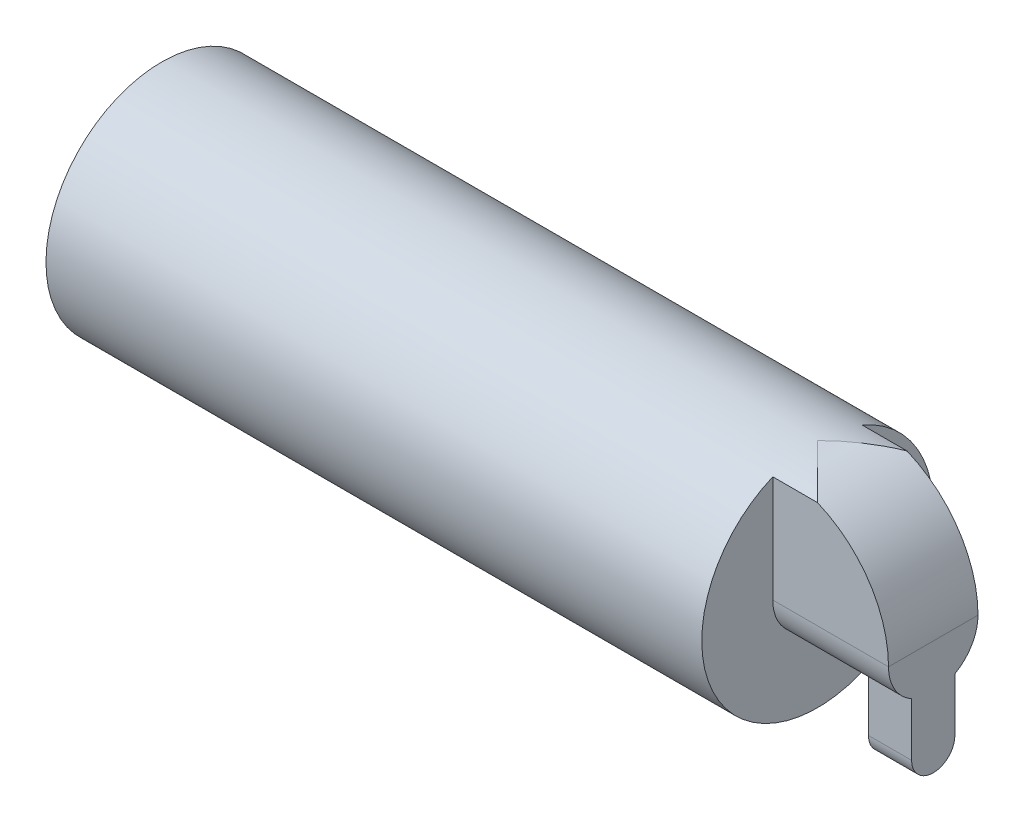
ISO-10303-21;
HEADER;
FILE_DESCRIPTION(('STEP AP214'),'2;1');
FILE_NAME('part.step','',(''),(''),'','','');
FILE_SCHEMA(('AUTOMOTIVE_DESIGN { 1 0 10303 214 1 1 1 1 }'));
ENDSEC;
DATA;
#1=APPLICATION_CONTEXT('core data for automotive mechanical design processes');
#2=APPLICATION_PROTOCOL_DEFINITION('international standard','automotive_design',2000,#1);
#3=PRODUCT_CONTEXT('',#1,'mechanical');
#4=PRODUCT('Part','Part','',(#3));
#5=PRODUCT_RELATED_PRODUCT_CATEGORY('part','',(#4));
#6=PRODUCT_DEFINITION_FORMATION('','',#4);
#7=PRODUCT_DEFINITION_CONTEXT('part definition',#1,'design');
#8=PRODUCT_DEFINITION('design','',#6,#7);
#9=PRODUCT_DEFINITION_SHAPE('','',#8);
#10=(LENGTH_UNIT() NAMED_UNIT(*) SI_UNIT(.MILLI.,.METRE.));
#11=(NAMED_UNIT(*) PLANE_ANGLE_UNIT() SI_UNIT($,.RADIAN.));
#12=(NAMED_UNIT(*) SI_UNIT($,.STERADIAN.) SOLID_ANGLE_UNIT());
#13=UNCERTAINTY_MEASURE_WITH_UNIT(LENGTH_MEASURE(1.E-05),#10,'distance_accuracy_value','');
#14=(GEOMETRIC_REPRESENTATION_CONTEXT(3) GLOBAL_UNCERTAINTY_ASSIGNED_CONTEXT((#13)) GLOBAL_UNIT_ASSIGNED_CONTEXT((#10,
#11,#12)) REPRESENTATION_CONTEXT('',''));
#15=CARTESIAN_POINT('',(0.,0.,0.));
#16=DIRECTION('',(0.,0.,1.));
#17=DIRECTION('',(1.,0.,0.));
#18=AXIS2_PLACEMENT_3D('',#15,#16,#17);
#19=CARTESIAN_POINT('',(42.5,0.,0.));
#20=DIRECTION('',(-1.,0.,0.));
#21=DIRECTION('',(0.,0.,1.));
#22=AXIS2_PLACEMENT_3D('',#19,#20,#21);
#23=CYLINDRICAL_SURFACE('',#22,7.5);
#24=CARTESIAN_POINT('',(0.,0.,0.));
#25=DIRECTION('',(1.,0.,0.));
#26=DIRECTION('',(0.,0.,-1.));
#27=AXIS2_PLACEMENT_3D('',#24,#25,#26);
#28=CIRCLE('',#27,7.5);
#29=CARTESIAN_POINT('',(0.,0.,-7.5));
#30=VERTEX_POINT('',#29);
#31=EDGE_CURVE('E386',#30,#30,#28,.T.);
#32=ORIENTED_EDGE('',*,*,#31,.T.);
#33=EDGE_LOOP('',(#32));
#34=FACE_BOUND('',#33,.T.);
#35=CARTESIAN_POINT('',(42.5,0.,0.));
#36=DIRECTION('',(-0.707106781186547,0.,-0.707106781186547));
#37=DIRECTION('',(-0.707106781186547,0.,0.707106781186547));
#38=AXIS2_PLACEMENT_3D('',#35,#36,#37);
#39=ELLIPSE('',#38,10.6066017177982,7.5);
#40=CARTESIAN_POINT('',(45.4,6.91664658631623,-2.9));
#41=VERTEX_POINT('',#40);
#42=CARTESIAN_POINT('',(42.5,7.5,0.));
#43=VERTEX_POINT('',#42);
#44=EDGE_CURVE('E335',#41,#43,#39,.F.);
#45=ORIENTED_EDGE('',*,*,#44,.F.);
#46=DIRECTION('',(-1.,0.,0.));
#47=VECTOR('',#46,1.);
#48=CARTESIAN_POINT('',(50.,6.91664658631623,-2.9));
#49=LINE('',#48,#47);
#50=CARTESIAN_POINT('',(42.5,6.91664658631623,-2.9));
#51=VERTEX_POINT('',#50);
#52=EDGE_CURVE('E372',#41,#51,#49,.T.);
#53=ORIENTED_EDGE('',*,*,#52,.T.);
#54=CARTESIAN_POINT('',(42.5,0.,0.));
#55=DIRECTION('',(1.,0.,0.));
#56=DIRECTION('',(0.,0.,-1.));
#57=AXIS2_PLACEMENT_3D('',#54,#55,#56);
#58=CIRCLE('',#57,7.5);
#59=CARTESIAN_POINT('',(42.5,6.91664658631623,2.9));
#60=VERTEX_POINT('',#59);
#61=EDGE_CURVE('E387',#60,#51,#58,.T.);
#62=ORIENTED_EDGE('',*,*,#61,.F.);
#63=DIRECTION('',(-1.,0.,0.));
#64=VECTOR('',#63,1.);
#65=CARTESIAN_POINT('',(50.,6.91664658631623,2.9));
#66=LINE('',#65,#64);
#67=CARTESIAN_POINT('',(45.4,6.91664658631623,2.9));
#68=VERTEX_POINT('',#67);
#69=EDGE_CURVE('E370',#68,#60,#66,.T.);
#70=ORIENTED_EDGE('',*,*,#69,.F.);
#71=CARTESIAN_POINT('',(42.5,0.,0.));
#72=DIRECTION('',(-0.707106781186547,0.,0.707106781186547));
#73=DIRECTION('',(-0.707106781186547,0.,-0.707106781186547));
#74=AXIS2_PLACEMENT_3D('',#71,#72,#73);
#75=ELLIPSE('',#74,10.6066017177982,7.5);
#76=EDGE_CURVE('E333',#43,#68,#75,.F.);
#77=ORIENTED_EDGE('',*,*,#76,.F.);
#78=EDGE_LOOP('',(#45,#53,#62,#70,#77));
#79=FACE_BOUND('',#78,.T.);
#80=ADVANCED_FACE('F33',(#34,#79),#23,.T.);
#81=CARTESIAN_POINT('',(50.,0.,-2.9));
#82=DIRECTION('',(0.,0.,1.));
#83=DIRECTION('',(1.,0.,0.));
#84=AXIS2_PLACEMENT_3D('',#81,#82,#83);
#85=PLANE('',#84);
#86=CARTESIAN_POINT('',(42.5,0.,-2.9));
#87=DIRECTION('',(0.,0.,1.));
#88=DIRECTION('',(1.,0.,0.));
#89=AXIS2_PLACEMENT_3D('',#86,#87,#88);
#90=CIRCLE('',#89,7.50000000000001);
#91=CARTESIAN_POINT('',(50.,0.,-2.9));
#92=VERTEX_POINT('',#91);
#93=EDGE_CURVE('E337',#92,#41,#90,.T.);
#94=ORIENTED_EDGE('',*,*,#93,.F.);
#95=DIRECTION('',(-1.,0.,0.));
#96=VECTOR('',#95,1.);
#97=CARTESIAN_POINT('',(50.,0.,-2.9));
#98=LINE('',#97,#96);
#99=CARTESIAN_POINT('',(42.5,0.,-2.9));
#100=VERTEX_POINT('',#99);
#101=EDGE_CURVE('E374',#92,#100,#98,.T.);
#102=ORIENTED_EDGE('',*,*,#101,.T.);
#103=DIRECTION('',(0.,-1.,0.));
#104=VECTOR('',#103,1.);
#105=CARTESIAN_POINT('',(42.5,0.,-2.9));
#106=LINE('',#105,#104);
#107=EDGE_CURVE('E380',#51,#100,#106,.T.);
#108=ORIENTED_EDGE('',*,*,#107,.F.);
#109=ORIENTED_EDGE('',*,*,#52,.F.);
#110=EDGE_LOOP('',(#94,#102,#108,#109));
#111=FACE_BOUND('',#110,.T.);
#112=ADVANCED_FACE('F430',(#111),#85,.F.);
#113=CARTESIAN_POINT('',(50.,0.,2.9));
#114=DIRECTION('',(0.,0.,-1.));
#115=DIRECTION('',(-1.,0.,0.));
#116=AXIS2_PLACEMENT_3D('',#113,#114,#115);
#117=PLANE('',#116);
#118=CARTESIAN_POINT('',(42.5,0.,2.9));
#119=DIRECTION('',(0.,0.,-1.));
#120=DIRECTION('',(-1.,0.,0.));
#121=AXIS2_PLACEMENT_3D('',#118,#119,#120);
#122=CIRCLE('',#121,7.50000000000001);
#123=CARTESIAN_POINT('',(50.,0.,2.9));
#124=VERTEX_POINT('',#123);
#125=EDGE_CURVE('E304',#68,#124,#122,.T.);
#126=ORIENTED_EDGE('',*,*,#125,.F.);
#127=ORIENTED_EDGE('',*,*,#69,.T.);
#128=DIRECTION('',(0.,1.,0.));
#129=VECTOR('',#128,1.);
#130=CARTESIAN_POINT('',(42.5,0.,2.9));
#131=LINE('',#130,#129);
#132=CARTESIAN_POINT('',(42.5,0.,2.9));
#133=VERTEX_POINT('',#132);
#134=EDGE_CURVE('E377',#133,#60,#131,.T.);
#135=ORIENTED_EDGE('',*,*,#134,.F.);
#136=DIRECTION('',(-1.,0.,0.));
#137=VECTOR('',#136,1.);
#138=CARTESIAN_POINT('',(50.,0.,2.9));
#139=LINE('',#138,#137);
#140=EDGE_CURVE('E367',#124,#133,#139,.T.);
#141=ORIENTED_EDGE('',*,*,#140,.F.);
#142=EDGE_LOOP('',(#126,#127,#135,#141));
#143=FACE_BOUND('',#142,.T.);
#144=ADVANCED_FACE('F411',(#143),#117,.F.);
#145=CARTESIAN_POINT('',(42.5,0.,0.));
#146=DIRECTION('',(1.,0.,0.));
#147=DIRECTION('',(0.,0.,-1.));
#148=AXIS2_PLACEMENT_3D('',#145,#146,#147);
#149=PLANE('',#148);
#150=ORIENTED_EDGE('',*,*,#61,.T.);
#151=ORIENTED_EDGE('',*,*,#107,.T.);
#152=CARTESIAN_POINT('',(42.5,0.,0.));
#153=DIRECTION('',(1.,0.,0.));
#154=DIRECTION('',(0.,0.,-1.));
#155=AXIS2_PLACEMENT_3D('',#152,#153,#154);
#156=CIRCLE('',#155,2.9);
#157=EDGE_CURVE('E383',#100,#133,#156,.F.);
#158=ORIENTED_EDGE('',*,*,#157,.T.);
#159=ORIENTED_EDGE('',*,*,#134,.T.);
#160=EDGE_LOOP('',(#150,#151,#158,#159));
#161=FACE_BOUND('',#160,.T.);
#162=ADVANCED_FACE('F445',(#161),#149,.T.);
#163=CARTESIAN_POINT('',(0.,0.,0.));
#164=DIRECTION('',(1.,0.,0.));
#165=DIRECTION('',(0.,0.,-1.));
#166=AXIS2_PLACEMENT_3D('',#163,#164,#165);
#167=PLANE('',#166);
#168=DIRECTION('',(0.,-1.,0.));
#169=VECTOR('',#168,1.);
#170=CARTESIAN_POINT('',(0.,-1.17157287525381,-2.82842712474619));
#171=LINE('',#170,#169);
#172=CARTESIAN_POINT('',(0.,-1.17157287525381,-2.82842712474619));
#173=VERTEX_POINT('',#172);
#174=CARTESIAN_POINT('',(0.,-2.82842712474619,-2.82842712474619));
#175=VERTEX_POINT('',#174);
#176=EDGE_CURVE('E262',#173,#175,#171,.T.);
#177=ORIENTED_EDGE('',*,*,#176,.F.);
#178=DIRECTION('',(0.,-0.707106781186548,0.707106781186547));
#179=VECTOR('',#178,1.);
#180=CARTESIAN_POINT('',(0.,0.,-4.));
#181=LINE('',#180,#179);
#182=CARTESIAN_POINT('',(0.,0.,-4.));
#183=VERTEX_POINT('',#182);
#184=EDGE_CURVE('E47',#183,#173,#181,.T.);
#185=ORIENTED_EDGE('',*,*,#184,.F.);
#186=DIRECTION('',(0.,-0.707106781186547,-0.707106781186548));
#187=VECTOR('',#186,1.);
#188=CARTESIAN_POINT('',(0.,0.,-4.));
#189=LINE('',#188,#187);
#190=CARTESIAN_POINT('',(0.,1.17157287525381,-2.82842712474619));
#191=VERTEX_POINT('',#190);
#192=EDGE_CURVE('E218',#191,#183,#189,.T.);
#193=ORIENTED_EDGE('',*,*,#192,.F.);
#194=DIRECTION('',(0.,-1.,0.));
#195=VECTOR('',#194,1.);
#196=CARTESIAN_POINT('',(0.,2.82842712474619,-2.82842712474619));
#197=LINE('',#196,#195);
#198=CARTESIAN_POINT('',(0.,2.82842712474619,-2.82842712474619));
#199=VERTEX_POINT('',#198);
#200=EDGE_CURVE('E221',#199,#191,#197,.T.);
#201=ORIENTED_EDGE('',*,*,#200,.F.);
#202=DIRECTION('',(0.,0.,-1.));
#203=VECTOR('',#202,1.);
#204=CARTESIAN_POINT('',(0.,2.82842712474619,-2.82842712474619));
#205=LINE('',#204,#203);
#206=CARTESIAN_POINT('',(0.,2.82842712474619,-1.17157287525381));
#207=VERTEX_POINT('',#206);
#208=EDGE_CURVE('E297',#207,#199,#205,.T.);
#209=ORIENTED_EDGE('',*,*,#208,.F.);
#210=DIRECTION('',(0.,-0.707106781186548,-0.707106781186547));
#211=VECTOR('',#210,1.);
#212=CARTESIAN_POINT('',(0.,2.82842712474619,-1.17157287525381));
#213=LINE('',#212,#211);
#214=CARTESIAN_POINT('',(0.,4.,0.));
#215=VERTEX_POINT('',#214);
#216=EDGE_CURVE('E294',#215,#207,#213,.T.);
#217=ORIENTED_EDGE('',*,*,#216,.F.);
#218=DIRECTION('',(0.,0.707106781186548,-0.707106781186547));
#219=VECTOR('',#218,1.);
#220=CARTESIAN_POINT('',(0.,4.,0.));
#221=LINE('',#220,#219);
#222=CARTESIAN_POINT('',(0.,2.82842712474619,1.17157287525381));
#223=VERTEX_POINT('',#222);
#224=EDGE_CURVE('E291',#223,#215,#221,.T.);
#225=ORIENTED_EDGE('',*,*,#224,.F.);
#226=DIRECTION('',(0.,0.,-1.));
#227=VECTOR('',#226,1.);
#228=CARTESIAN_POINT('',(0.,2.82842712474619,1.17157287525381));
#229=LINE('',#228,#227);
#230=CARTESIAN_POINT('',(0.,2.82842712474619,2.82842712474619));
#231=VERTEX_POINT('',#230);
#232=EDGE_CURVE('E288',#231,#223,#229,.T.);
#233=ORIENTED_EDGE('',*,*,#232,.F.);
#234=DIRECTION('',(0.,1.,0.));
#235=VECTOR('',#234,1.);
#236=CARTESIAN_POINT('',(0.,2.82842712474619,2.82842712474619));
#237=LINE('',#236,#235);
#238=CARTESIAN_POINT('',(0.,1.17157287525381,2.82842712474619));
#239=VERTEX_POINT('',#238);
#240=EDGE_CURVE('E285',#239,#231,#237,.T.);
#241=ORIENTED_EDGE('',*,*,#240,.F.);
#242=DIRECTION('',(0.,0.707106781186547,-0.707106781186548));
#243=VECTOR('',#242,1.);
#244=CARTESIAN_POINT('',(0.,1.17157287525381,2.82842712474619));
#245=LINE('',#244,#243);
#246=CARTESIAN_POINT('',(0.,0.,4.));
#247=VERTEX_POINT('',#246);
#248=EDGE_CURVE('E282',#247,#239,#245,.T.);
#249=ORIENTED_EDGE('',*,*,#248,.F.);
#250=DIRECTION('',(0.,0.707106781186548,0.707106781186547));
#251=VECTOR('',#250,1.);
#252=CARTESIAN_POINT('',(0.,-1.17157287525381,2.82842712474619));
#253=LINE('',#252,#251);
#254=CARTESIAN_POINT('',(0.,-1.17157287525381,2.82842712474619));
#255=VERTEX_POINT('',#254);
#256=EDGE_CURVE('E279',#255,#247,#253,.T.);
#257=ORIENTED_EDGE('',*,*,#256,.F.);
#258=DIRECTION('',(0.,1.,0.));
#259=VECTOR('',#258,1.);
#260=CARTESIAN_POINT('',(0.,-1.17157287525381,2.82842712474619));
#261=LINE('',#260,#259);
#262=CARTESIAN_POINT('',(0.,-2.82842712474619,2.82842712474619));
#263=VERTEX_POINT('',#262);
#264=EDGE_CURVE('E276',#263,#255,#261,.T.);
#265=ORIENTED_EDGE('',*,*,#264,.F.);
#266=DIRECTION('',(0.,0.,1.));
#267=VECTOR('',#266,1.);
#268=CARTESIAN_POINT('',(0.,-2.82842712474619,1.17157287525381));
#269=LINE('',#268,#267);
#270=CARTESIAN_POINT('',(0.,-2.82842712474619,1.17157287525381));
#271=VERTEX_POINT('',#270);
#272=EDGE_CURVE('E273',#271,#263,#269,.T.);
#273=ORIENTED_EDGE('',*,*,#272,.F.);
#274=DIRECTION('',(0.,0.707106781186547,0.707106781186547));
#275=VECTOR('',#274,1.);
#276=CARTESIAN_POINT('',(0.,-4.,0.));
#277=LINE('',#276,#275);
#278=CARTESIAN_POINT('',(0.,-4.,0.));
#279=VERTEX_POINT('',#278);
#280=EDGE_CURVE('E270',#279,#271,#277,.T.);
#281=ORIENTED_EDGE('',*,*,#280,.F.);
#282=DIRECTION('',(0.,-0.707106781186547,0.707106781186548));
#283=VECTOR('',#282,1.);
#284=CARTESIAN_POINT('',(0.,-2.82842712474619,-1.17157287525381));
#285=LINE('',#284,#283);
#286=CARTESIAN_POINT('',(0.,-2.82842712474619,-1.17157287525381));
#287=VERTEX_POINT('',#286);
#288=EDGE_CURVE('E267',#287,#279,#285,.T.);
#289=ORIENTED_EDGE('',*,*,#288,.F.);
#290=DIRECTION('',(0.,0.,1.));
#291=VECTOR('',#290,1.);
#292=CARTESIAN_POINT('',(0.,-2.82842712474619,-2.82842712474619));
#293=LINE('',#292,#291);
#294=EDGE_CURVE('E264',#175,#287,#293,.T.);
#295=ORIENTED_EDGE('',*,*,#294,.F.);
#296=EDGE_LOOP('',(#177,#185,#193,#201,#209,#217,#225,#233,#241,#249,#257,#265,#273,#281,#289,#295));
#297=FACE_BOUND('',#296,.T.);
#298=ORIENTED_EDGE('',*,*,#31,.F.);
#299=EDGE_LOOP('',(#298));
#300=FACE_BOUND('',#299,.T.);
#301=ADVANCED_FACE('F447',(#297,#300),#167,.F.);
#302=CARTESIAN_POINT('',(50.,0.,0.));
#303=DIRECTION('',(-1.,0.,0.));
#304=DIRECTION('',(0.,0.,1.));
#305=AXIS2_PLACEMENT_3D('',#302,#303,#304);
#306=CYLINDRICAL_SURFACE('',#305,2.9);
#307=CARTESIAN_POINT('',(47.2,0.,0.));
#308=DIRECTION('',(1.,0.,0.));
#309=DIRECTION('',(0.,0.,-1.));
#310=AXIS2_PLACEMENT_3D('',#307,#308,#309);
#311=CIRCLE('',#310,2.9);
#312=CARTESIAN_POINT('',(47.2,-2.53968501984006,1.4));
#313=VERTEX_POINT('',#312);
#314=CARTESIAN_POINT('',(47.2,-2.53968501984006,-1.4));
#315=VERTEX_POINT('',#314);
#316=EDGE_CURVE('E40',#313,#315,#311,.T.);
#317=ORIENTED_EDGE('',*,*,#316,.F.);
#318=DIRECTION('',(-1.,0.,0.));
#319=VECTOR('',#318,1.);
#320=CARTESIAN_POINT('',(50.,-2.53968501984006,1.4));
#321=LINE('',#320,#319);
#322=CARTESIAN_POINT('',(50.,-2.53968501984006,1.4));
#323=VERTEX_POINT('',#322);
#324=EDGE_CURVE('E360',#313,#323,#321,.F.);
#325=ORIENTED_EDGE('',*,*,#324,.T.);
#326=CARTESIAN_POINT('',(50.,0.,0.));
#327=DIRECTION('',(1.,0.,0.));
#328=DIRECTION('',(0.,0.,-1.));
#329=AXIS2_PLACEMENT_3D('',#326,#327,#328);
#330=CIRCLE('',#329,2.9);
#331=EDGE_CURVE('E364',#124,#323,#330,.T.);
#332=ORIENTED_EDGE('',*,*,#331,.F.);
#333=ORIENTED_EDGE('',*,*,#140,.T.);
#334=ORIENTED_EDGE('',*,*,#157,.F.);
#335=ORIENTED_EDGE('',*,*,#101,.F.);
#336=CARTESIAN_POINT('',(50.,-2.53968501984006,-1.4));
#337=VERTEX_POINT('',#336);
#338=EDGE_CURVE('E363',#337,#92,#330,.T.);
#339=ORIENTED_EDGE('',*,*,#338,.F.);
#340=DIRECTION('',(-1.,0.,0.));
#341=VECTOR('',#340,1.);
#342=CARTESIAN_POINT('',(50.,-2.53968501984006,-1.4));
#343=LINE('',#342,#341);
#344=EDGE_CURVE('E356',#337,#315,#343,.T.);
#345=ORIENTED_EDGE('',*,*,#344,.T.);
#346=EDGE_LOOP('',(#317,#325,#332,#333,#334,#335,#339,#345));
#347=FACE_BOUND('',#346,.T.);
#348=ADVANCED_FACE('F401',(#347),#306,.T.);
#349=CARTESIAN_POINT('',(50.,0.,0.));
#350=DIRECTION('',(1.,0.,0.));
#351=DIRECTION('',(0.,0.,-1.));
#352=AXIS2_PLACEMENT_3D('',#349,#350,#351);
#353=PLANE('',#352);
#354=DIRECTION('',(0.,0.,-1.));
#355=VECTOR('',#354,1.);
#356=CARTESIAN_POINT('',(50.,0.,7.5));
#357=LINE('',#356,#355);
#358=EDGE_CURVE('E11',#124,#92,#357,.T.);
#359=ORIENTED_EDGE('',*,*,#358,.F.);
#360=ORIENTED_EDGE('',*,*,#331,.T.);
#361=DIRECTION('',(0.,-1.,0.));
#362=VECTOR('',#361,1.);
#363=CARTESIAN_POINT('',(50.,-6.,1.4));
#364=LINE('',#363,#362);
#365=CARTESIAN_POINT('',(50.,-6.,1.4));
#366=VERTEX_POINT('',#365);
#367=EDGE_CURVE('E344',#323,#366,#364,.T.);
#368=ORIENTED_EDGE('',*,*,#367,.T.);
#369=CARTESIAN_POINT('',(50.,-6.,0.));
#370=DIRECTION('',(1.,0.,0.));
#371=DIRECTION('',(0.,0.,-1.));
#372=AXIS2_PLACEMENT_3D('',#369,#370,#371);
#373=CIRCLE('',#372,1.4);
#374=CARTESIAN_POINT('',(50.,-6.,-1.4));
#375=VERTEX_POINT('',#374);
#376=EDGE_CURVE('E339',#366,#375,#373,.T.);
#377=ORIENTED_EDGE('',*,*,#376,.T.);
#378=DIRECTION('',(0.,1.,0.));
#379=VECTOR('',#378,1.);
#380=CARTESIAN_POINT('',(50.,0.,-1.4));
#381=LINE('',#380,#379);
#382=EDGE_CURVE('E55',#375,#337,#381,.T.);
#383=ORIENTED_EDGE('',*,*,#382,.T.);
#384=ORIENTED_EDGE('',*,*,#338,.T.);
#385=EDGE_LOOP('',(#359,#360,#368,#377,#383,#384));
#386=FACE_BOUND('',#385,.T.);
#387=ADVANCED_FACE('F404',(#386),#353,.T.);
#388=CARTESIAN_POINT('',(47.2,-6.,1.4));
#389=DIRECTION('',(0.,0.,1.));
#390=DIRECTION('',(1.,0.,0.));
#391=AXIS2_PLACEMENT_3D('',#388,#389,#390);
#392=PLANE('',#391);
#393=ORIENTED_EDGE('',*,*,#324,.F.);
#394=DIRECTION('',(0.,-1.,0.));
#395=VECTOR('',#394,1.);
#396=CARTESIAN_POINT('',(47.2,-6.,1.4));
#397=LINE('',#396,#395);
#398=CARTESIAN_POINT('',(47.2,-6.,1.4));
#399=VERTEX_POINT('',#398);
#400=EDGE_CURVE('E347',#313,#399,#397,.T.);
#401=ORIENTED_EDGE('',*,*,#400,.T.);
#402=DIRECTION('',(1.,0.,0.));
#403=VECTOR('',#402,1.);
#404=CARTESIAN_POINT('',(47.2,-6.,1.4));
#405=LINE('',#404,#403);
#406=EDGE_CURVE('E353',#399,#366,#405,.T.);
#407=ORIENTED_EDGE('',*,*,#406,.T.);
#408=ORIENTED_EDGE('',*,*,#367,.F.);
#409=EDGE_LOOP('',(#393,#401,#407,#408));
#410=FACE_BOUND('',#409,.T.);
#411=ADVANCED_FACE('F414',(#410),#392,.T.);
#412=CARTESIAN_POINT('',(47.2,0.,-1.4));
#413=DIRECTION('',(0.,0.,-1.));
#414=DIRECTION('',(-1.,0.,0.));
#415=AXIS2_PLACEMENT_3D('',#412,#413,#414);
#416=PLANE('',#415);
#417=ORIENTED_EDGE('',*,*,#344,.F.);
#418=ORIENTED_EDGE('',*,*,#382,.F.);
#419=DIRECTION('',(1.,0.,0.));
#420=VECTOR('',#419,1.);
#421=CARTESIAN_POINT('',(47.2,-6.,-1.4));
#422=LINE('',#421,#420);
#423=CARTESIAN_POINT('',(47.2,-6.,-1.4));
#424=VERTEX_POINT('',#423);
#425=EDGE_CURVE('E349',#424,#375,#422,.T.);
#426=ORIENTED_EDGE('',*,*,#425,.F.);
#427=DIRECTION('',(0.,1.,0.));
#428=VECTOR('',#427,1.);
#429=CARTESIAN_POINT('',(47.2,0.,-1.4));
#430=LINE('',#429,#428);
#431=EDGE_CURVE('E343',#424,#315,#430,.T.);
#432=ORIENTED_EDGE('',*,*,#431,.T.);
#433=EDGE_LOOP('',(#417,#418,#426,#432));
#434=FACE_BOUND('',#433,.T.);
#435=ADVANCED_FACE('F399',(#434),#416,.T.);
#436=CARTESIAN_POINT('',(47.2,-6.,0.));
#437=DIRECTION('',(1.,0.,0.));
#438=DIRECTION('',(0.,0.,-1.));
#439=AXIS2_PLACEMENT_3D('',#436,#437,#438);
#440=CYLINDRICAL_SURFACE('',#439,1.4);
#441=ORIENTED_EDGE('',*,*,#376,.F.);
#442=ORIENTED_EDGE('',*,*,#406,.F.);
#443=CARTESIAN_POINT('',(47.2,-6.,0.));
#444=DIRECTION('',(1.,0.,0.));
#445=DIRECTION('',(0.,0.,-1.));
#446=AXIS2_PLACEMENT_3D('',#443,#444,#445);
#447=CIRCLE('',#446,1.4);
#448=EDGE_CURVE('E340',#399,#424,#447,.T.);
#449=ORIENTED_EDGE('',*,*,#448,.T.);
#450=ORIENTED_EDGE('',*,*,#425,.T.);
#451=EDGE_LOOP('',(#441,#442,#449,#450));
#452=FACE_BOUND('',#451,.T.);
#453=ADVANCED_FACE('F418',(#452),#440,.T.);
#454=CARTESIAN_POINT('',(47.2,-6.,0.));
#455=DIRECTION('',(1.,0.,0.));
#456=DIRECTION('',(0.,0.,-1.));
#457=AXIS2_PLACEMENT_3D('',#454,#455,#456);
#458=PLANE('',#457);
#459=ORIENTED_EDGE('',*,*,#400,.F.);
#460=ORIENTED_EDGE('',*,*,#316,.T.);
#461=ORIENTED_EDGE('',*,*,#431,.F.);
#462=ORIENTED_EDGE('',*,*,#448,.F.);
#463=EDGE_LOOP('',(#459,#460,#461,#462));
#464=FACE_BOUND('',#463,.T.);
#465=ADVANCED_FACE('F395',(#464),#458,.F.);
#466=CARTESIAN_POINT('',(42.5,0.,7.5));
#467=DIRECTION('',(0.,0.,-1.));
#468=DIRECTION('',(-1.,0.,0.));
#469=AXIS2_PLACEMENT_3D('',#466,#467,#468);
#470=CYLINDRICAL_SURFACE('',#469,7.50000000000001);
#471=ORIENTED_EDGE('',*,*,#93,.T.);
#472=ORIENTED_EDGE('',*,*,#44,.T.);
#473=ORIENTED_EDGE('',*,*,#76,.T.);
#474=ORIENTED_EDGE('',*,*,#125,.T.);
#475=ORIENTED_EDGE('',*,*,#358,.T.);
#476=EDGE_LOOP('',(#471,#472,#473,#474,#475));
#477=FACE_BOUND('',#476,.T.);
#478=ADVANCED_FACE('F425',(#477),#470,.T.);
#479=CARTESIAN_POINT('',(8.,0.,-4.));
#480=DIRECTION('',(0.,-0.707106781186547,-0.707106781186548));
#481=DIRECTION('',(0.,0.707106781186548,-0.707106781186547));
#482=AXIS2_PLACEMENT_3D('',#479,#480,#481);
#483=PLANE('',#482);
#484=ORIENTED_EDGE('',*,*,#184,.T.);
#485=DIRECTION('',(-1.,0.,0.));
#486=VECTOR('',#485,1.);
#487=CARTESIAN_POINT('',(8.,-1.17157287525381,-2.82842712474619));
#488=LINE('',#487,#486);
#489=CARTESIAN_POINT('',(8.,-1.17157287525381,-2.82842712474619));
#490=VERTEX_POINT('',#489);
#491=EDGE_CURVE('E195',#490,#173,#488,.T.);
#492=ORIENTED_EDGE('',*,*,#491,.F.);
#493=DIRECTION('',(0.,-0.707106781186548,0.707106781186547));
#494=VECTOR('',#493,1.);
#495=CARTESIAN_POINT('',(8.,0.,-4.));
#496=LINE('',#495,#494);
#497=CARTESIAN_POINT('',(8.,0.,-4.));
#498=VERTEX_POINT('',#497);
#499=EDGE_CURVE('E199',#498,#490,#496,.T.);
#500=ORIENTED_EDGE('',*,*,#499,.F.);
#501=DIRECTION('',(-1.,0.,0.));
#502=VECTOR('',#501,1.);
#503=CARTESIAN_POINT('',(8.,0.,-4.));
#504=LINE('',#503,#502);
#505=EDGE_CURVE('E302',#498,#183,#504,.T.);
#506=ORIENTED_EDGE('',*,*,#505,.T.);
#507=EDGE_LOOP('',(#484,#492,#500,#506));
#508=FACE_BOUND('',#507,.T.);
#509=ADVANCED_FACE('F197',(#508),#483,.F.);
#510=CARTESIAN_POINT('',(8.,0.,-4.));
#511=DIRECTION('',(0.,0.707106781186548,-0.707106781186547));
#512=DIRECTION('',(0.,0.707106781186547,0.707106781186548));
#513=AXIS2_PLACEMENT_3D('',#510,#511,#512);
#514=PLANE('',#513);
#515=ORIENTED_EDGE('',*,*,#192,.T.);
#516=ORIENTED_EDGE('',*,*,#505,.F.);
#517=DIRECTION('',(0.,-0.707106781186547,-0.707106781186548));
#518=VECTOR('',#517,1.);
#519=CARTESIAN_POINT('',(8.,0.,-4.));
#520=LINE('',#519,#518);
#521=CARTESIAN_POINT('',(8.,1.17157287525381,-2.82842712474619));
#522=VERTEX_POINT('',#521);
#523=EDGE_CURVE('E205',#522,#498,#520,.T.);
#524=ORIENTED_EDGE('',*,*,#523,.F.);
#525=DIRECTION('',(-1.,0.,0.));
#526=VECTOR('',#525,1.);
#527=CARTESIAN_POINT('',(8.,1.17157287525381,-2.82842712474619));
#528=LINE('',#527,#526);
#529=EDGE_CURVE('E305',#522,#191,#528,.T.);
#530=ORIENTED_EDGE('',*,*,#529,.T.);
#531=EDGE_LOOP('',(#515,#516,#524,#530));
#532=FACE_BOUND('',#531,.T.);
#533=ADVANCED_FACE('F469',(#532),#514,.F.);
#534=CARTESIAN_POINT('',(8.,2.82842712474619,-2.82842712474619));
#535=DIRECTION('',(0.,0.,-1.));
#536=DIRECTION('',(-1.,0.,0.));
#537=AXIS2_PLACEMENT_3D('',#534,#535,#536);
#538=PLANE('',#537);
#539=ORIENTED_EDGE('',*,*,#200,.T.);
#540=ORIENTED_EDGE('',*,*,#529,.F.);
#541=DIRECTION('',(0.,-1.,0.));
#542=VECTOR('',#541,1.);
#543=CARTESIAN_POINT('',(8.,2.82842712474619,-2.82842712474619));
#544=LINE('',#543,#542);
#545=CARTESIAN_POINT('',(8.,2.82842712474619,-2.82842712474619));
#546=VERTEX_POINT('',#545);
#547=EDGE_CURVE('E258',#546,#522,#544,.T.);
#548=ORIENTED_EDGE('',*,*,#547,.F.);
#549=DIRECTION('',(-1.,0.,0.));
#550=VECTOR('',#549,1.);
#551=CARTESIAN_POINT('',(8.,2.82842712474619,-2.82842712474619));
#552=LINE('',#551,#550);
#553=EDGE_CURVE('E307',#546,#199,#552,.T.);
#554=ORIENTED_EDGE('',*,*,#553,.T.);
#555=EDGE_LOOP('',(#539,#540,#548,#554));
#556=FACE_BOUND('',#555,.T.);
#557=ADVANCED_FACE('F519',(#556),#538,.F.);
#558=CARTESIAN_POINT('',(8.,2.82842712474619,-2.82842712474619));
#559=DIRECTION('',(0.,1.,0.));
#560=DIRECTION('',(0.,0.,1.));
#561=AXIS2_PLACEMENT_3D('',#558,#559,#560);
#562=PLANE('',#561);
#563=ORIENTED_EDGE('',*,*,#208,.T.);
#564=ORIENTED_EDGE('',*,*,#553,.F.);
#565=DIRECTION('',(0.,0.,-1.));
#566=VECTOR('',#565,1.);
#567=CARTESIAN_POINT('',(8.,2.82842712474619,-2.82842712474619));
#568=LINE('',#567,#566);
#569=CARTESIAN_POINT('',(8.,2.82842712474619,-1.17157287525381));
#570=VERTEX_POINT('',#569);
#571=EDGE_CURVE('E255',#570,#546,#568,.T.);
#572=ORIENTED_EDGE('',*,*,#571,.F.);
#573=DIRECTION('',(-1.,0.,0.));
#574=VECTOR('',#573,1.);
#575=CARTESIAN_POINT('',(8.,2.82842712474619,-1.17157287525381));
#576=LINE('',#575,#574);
#577=EDGE_CURVE('E309',#570,#207,#576,.T.);
#578=ORIENTED_EDGE('',*,*,#577,.T.);
#579=EDGE_LOOP('',(#563,#564,#572,#578));
#580=FACE_BOUND('',#579,.T.);
#581=ADVANCED_FACE('F515',(#580),#562,.F.);
#582=CARTESIAN_POINT('',(8.,2.82842712474619,-1.17157287525381));
#583=DIRECTION('',(0.,0.707106781186547,-0.707106781186548));
#584=DIRECTION('',(0.,0.707106781186548,0.707106781186547));
#585=AXIS2_PLACEMENT_3D('',#582,#583,#584);
#586=PLANE('',#585);
#587=ORIENTED_EDGE('',*,*,#216,.T.);
#588=ORIENTED_EDGE('',*,*,#577,.F.);
#589=DIRECTION('',(0.,-0.707106781186548,-0.707106781186547));
#590=VECTOR('',#589,1.);
#591=CARTESIAN_POINT('',(8.,2.82842712474619,-1.17157287525381));
#592=LINE('',#591,#590);
#593=CARTESIAN_POINT('',(8.,4.,0.));
#594=VERTEX_POINT('',#593);
#595=EDGE_CURVE('E252',#594,#570,#592,.T.);
#596=ORIENTED_EDGE('',*,*,#595,.F.);
#597=DIRECTION('',(-1.,0.,0.));
#598=VECTOR('',#597,1.);
#599=CARTESIAN_POINT('',(8.,4.,0.));
#600=LINE('',#599,#598);
#601=EDGE_CURVE('E311',#594,#215,#600,.T.);
#602=ORIENTED_EDGE('',*,*,#601,.T.);
#603=EDGE_LOOP('',(#587,#588,#596,#602));
#604=FACE_BOUND('',#603,.T.);
#605=ADVANCED_FACE('F511',(#604),#586,.F.);
#606=CARTESIAN_POINT('',(8.,4.,0.));
#607=DIRECTION('',(0.,0.707106781186547,0.707106781186548));
#608=DIRECTION('',(0.,-0.707106781186548,0.707106781186547));
#609=AXIS2_PLACEMENT_3D('',#606,#607,#608);
#610=PLANE('',#609);
#611=ORIENTED_EDGE('',*,*,#224,.T.);
#612=ORIENTED_EDGE('',*,*,#601,.F.);
#613=DIRECTION('',(0.,0.707106781186548,-0.707106781186547));
#614=VECTOR('',#613,1.);
#615=CARTESIAN_POINT('',(8.,4.,0.));
#616=LINE('',#615,#614);
#617=CARTESIAN_POINT('',(8.,2.82842712474619,1.17157287525381));
#618=VERTEX_POINT('',#617);
#619=EDGE_CURVE('E249',#618,#594,#616,.T.);
#620=ORIENTED_EDGE('',*,*,#619,.F.);
#621=DIRECTION('',(-1.,0.,0.));
#622=VECTOR('',#621,1.);
#623=CARTESIAN_POINT('',(8.,2.82842712474619,1.17157287525381));
#624=LINE('',#623,#622);
#625=EDGE_CURVE('E313',#618,#223,#624,.T.);
#626=ORIENTED_EDGE('',*,*,#625,.T.);
#627=EDGE_LOOP('',(#611,#612,#620,#626));
#628=FACE_BOUND('',#627,.T.);
#629=ADVANCED_FACE('F507',(#628),#610,.F.);
#630=CARTESIAN_POINT('',(8.,2.82842712474619,1.17157287525381));
#631=DIRECTION('',(0.,1.,0.));
#632=DIRECTION('',(0.,0.,1.));
#633=AXIS2_PLACEMENT_3D('',#630,#631,#632);
#634=PLANE('',#633);
#635=ORIENTED_EDGE('',*,*,#232,.T.);
#636=ORIENTED_EDGE('',*,*,#625,.F.);
#637=DIRECTION('',(0.,0.,-1.));
#638=VECTOR('',#637,1.);
#639=CARTESIAN_POINT('',(8.,2.82842712474619,1.17157287525381));
#640=LINE('',#639,#638);
#641=CARTESIAN_POINT('',(8.,2.82842712474619,2.82842712474619));
#642=VERTEX_POINT('',#641);
#643=EDGE_CURVE('E246',#642,#618,#640,.T.);
#644=ORIENTED_EDGE('',*,*,#643,.F.);
#645=DIRECTION('',(-1.,0.,0.));
#646=VECTOR('',#645,1.);
#647=CARTESIAN_POINT('',(8.,2.82842712474619,2.82842712474619));
#648=LINE('',#647,#646);
#649=EDGE_CURVE('E315',#642,#231,#648,.T.);
#650=ORIENTED_EDGE('',*,*,#649,.T.);
#651=EDGE_LOOP('',(#635,#636,#644,#650));
#652=FACE_BOUND('',#651,.T.);
#653=ADVANCED_FACE('F503',(#652),#634,.F.);
#654=CARTESIAN_POINT('',(8.,2.82842712474619,2.82842712474619));
#655=DIRECTION('',(0.,0.,1.));
#656=DIRECTION('',(1.,0.,0.));
#657=AXIS2_PLACEMENT_3D('',#654,#655,#656);
#658=PLANE('',#657);
#659=ORIENTED_EDGE('',*,*,#240,.T.);
#660=ORIENTED_EDGE('',*,*,#649,.F.);
#661=DIRECTION('',(0.,1.,0.));
#662=VECTOR('',#661,1.);
#663=CARTESIAN_POINT('',(8.,2.82842712474619,2.82842712474619));
#664=LINE('',#663,#662);
#665=CARTESIAN_POINT('',(8.,1.17157287525381,2.82842712474619));
#666=VERTEX_POINT('',#665);
#667=EDGE_CURVE('E243',#666,#642,#664,.T.);
#668=ORIENTED_EDGE('',*,*,#667,.F.);
#669=DIRECTION('',(-1.,0.,0.));
#670=VECTOR('',#669,1.);
#671=CARTESIAN_POINT('',(8.,1.17157287525381,2.82842712474619));
#672=LINE('',#671,#670);
#673=EDGE_CURVE('E317',#666,#239,#672,.T.);
#674=ORIENTED_EDGE('',*,*,#673,.T.);
#675=EDGE_LOOP('',(#659,#660,#668,#674));
#676=FACE_BOUND('',#675,.T.);
#677=ADVANCED_FACE('F499',(#676),#658,.F.);
#678=CARTESIAN_POINT('',(8.,1.17157287525381,2.82842712474619));
#679=DIRECTION('',(0.,0.707106781186548,0.707106781186547));
#680=DIRECTION('',(0.,-0.707106781186547,0.707106781186548));
#681=AXIS2_PLACEMENT_3D('',#678,#679,#680);
#682=PLANE('',#681);
#683=ORIENTED_EDGE('',*,*,#248,.T.);
#684=ORIENTED_EDGE('',*,*,#673,.F.);
#685=DIRECTION('',(0.,0.707106781186547,-0.707106781186548));
#686=VECTOR('',#685,1.);
#687=CARTESIAN_POINT('',(8.,1.17157287525381,2.82842712474619));
#688=LINE('',#687,#686);
#689=CARTESIAN_POINT('',(8.,0.,4.));
#690=VERTEX_POINT('',#689);
#691=EDGE_CURVE('E240',#690,#666,#688,.T.);
#692=ORIENTED_EDGE('',*,*,#691,.F.);
#693=DIRECTION('',(-1.,0.,0.));
#694=VECTOR('',#693,1.);
#695=CARTESIAN_POINT('',(8.,0.,4.));
#696=LINE('',#695,#694);
#697=EDGE_CURVE('E319',#690,#247,#696,.T.);
#698=ORIENTED_EDGE('',*,*,#697,.T.);
#699=EDGE_LOOP('',(#683,#684,#692,#698));
#700=FACE_BOUND('',#699,.T.);
#701=ADVANCED_FACE('F495',(#700),#682,.F.);
#702=CARTESIAN_POINT('',(8.,-1.17157287525381,2.82842712474619));
#703=DIRECTION('',(0.,-0.707106781186547,0.707106781186548));
#704=DIRECTION('',(0.,-0.707106781186548,-0.707106781186547));
#705=AXIS2_PLACEMENT_3D('',#702,#703,#704);
#706=PLANE('',#705);
#707=ORIENTED_EDGE('',*,*,#256,.T.);
#708=ORIENTED_EDGE('',*,*,#697,.F.);
#709=DIRECTION('',(0.,0.707106781186548,0.707106781186547));
#710=VECTOR('',#709,1.);
#711=CARTESIAN_POINT('',(8.,-1.17157287525381,2.82842712474619));
#712=LINE('',#711,#710);
#713=CARTESIAN_POINT('',(8.,-1.17157287525381,2.82842712474619));
#714=VERTEX_POINT('',#713);
#715=EDGE_CURVE('E237',#714,#690,#712,.T.);
#716=ORIENTED_EDGE('',*,*,#715,.F.);
#717=DIRECTION('',(-1.,0.,0.));
#718=VECTOR('',#717,1.);
#719=CARTESIAN_POINT('',(8.,-1.17157287525381,2.82842712474619));
#720=LINE('',#719,#718);
#721=EDGE_CURVE('E321',#714,#255,#720,.T.);
#722=ORIENTED_EDGE('',*,*,#721,.T.);
#723=EDGE_LOOP('',(#707,#708,#716,#722));
#724=FACE_BOUND('',#723,.T.);
#725=ADVANCED_FACE('F491',(#724),#706,.F.);
#726=CARTESIAN_POINT('',(8.,-1.17157287525381,2.82842712474619));
#727=DIRECTION('',(0.,0.,1.));
#728=DIRECTION('',(1.,0.,0.));
#729=AXIS2_PLACEMENT_3D('',#726,#727,#728);
#730=PLANE('',#729);
#731=ORIENTED_EDGE('',*,*,#264,.T.);
#732=ORIENTED_EDGE('',*,*,#721,.F.);
#733=DIRECTION('',(0.,1.,0.));
#734=VECTOR('',#733,1.);
#735=CARTESIAN_POINT('',(8.,-1.17157287525381,2.82842712474619));
#736=LINE('',#735,#734);
#737=CARTESIAN_POINT('',(8.,-2.82842712474619,2.82842712474619));
#738=VERTEX_POINT('',#737);
#739=EDGE_CURVE('E234',#738,#714,#736,.T.);
#740=ORIENTED_EDGE('',*,*,#739,.F.);
#741=DIRECTION('',(-1.,0.,0.));
#742=VECTOR('',#741,1.);
#743=CARTESIAN_POINT('',(8.,-2.82842712474619,2.82842712474619));
#744=LINE('',#743,#742);
#745=EDGE_CURVE('E323',#738,#263,#744,.T.);
#746=ORIENTED_EDGE('',*,*,#745,.T.);
#747=EDGE_LOOP('',(#731,#732,#740,#746));
#748=FACE_BOUND('',#747,.T.);
#749=ADVANCED_FACE('F487',(#748),#730,.F.);
#750=CARTESIAN_POINT('',(8.,-2.82842712474619,1.17157287525381));
#751=DIRECTION('',(0.,-1.,0.));
#752=DIRECTION('',(0.,0.,-1.));
#753=AXIS2_PLACEMENT_3D('',#750,#751,#752);
#754=PLANE('',#753);
#755=ORIENTED_EDGE('',*,*,#272,.T.);
#756=ORIENTED_EDGE('',*,*,#745,.F.);
#757=DIRECTION('',(0.,0.,1.));
#758=VECTOR('',#757,1.);
#759=CARTESIAN_POINT('',(8.,-2.82842712474619,1.17157287525381));
#760=LINE('',#759,#758);
#761=CARTESIAN_POINT('',(8.,-2.82842712474619,1.17157287525381));
#762=VERTEX_POINT('',#761);
#763=EDGE_CURVE('E231',#762,#738,#760,.T.);
#764=ORIENTED_EDGE('',*,*,#763,.F.);
#765=DIRECTION('',(-1.,0.,0.));
#766=VECTOR('',#765,1.);
#767=CARTESIAN_POINT('',(8.,-2.82842712474619,1.17157287525381));
#768=LINE('',#767,#766);
#769=EDGE_CURVE('E325',#762,#271,#768,.T.);
#770=ORIENTED_EDGE('',*,*,#769,.T.);
#771=EDGE_LOOP('',(#755,#756,#764,#770));
#772=FACE_BOUND('',#771,.T.);
#773=ADVANCED_FACE('F483',(#772),#754,.F.);
#774=CARTESIAN_POINT('',(8.,-4.,0.));
#775=DIRECTION('',(0.,-0.707106781186547,0.707106781186547));
#776=DIRECTION('',(0.,-0.707106781186548,-0.707106781186548));
#777=AXIS2_PLACEMENT_3D('',#774,#775,#776);
#778=PLANE('',#777);
#779=ORIENTED_EDGE('',*,*,#280,.T.);
#780=ORIENTED_EDGE('',*,*,#769,.F.);
#781=DIRECTION('',(0.,0.707106781186547,0.707106781186547));
#782=VECTOR('',#781,1.);
#783=CARTESIAN_POINT('',(8.,-4.,0.));
#784=LINE('',#783,#782);
#785=CARTESIAN_POINT('',(8.,-4.,0.));
#786=VERTEX_POINT('',#785);
#787=EDGE_CURVE('E228',#786,#762,#784,.T.);
#788=ORIENTED_EDGE('',*,*,#787,.F.);
#789=DIRECTION('',(-1.,0.,0.));
#790=VECTOR('',#789,1.);
#791=CARTESIAN_POINT('',(8.,-4.,0.));
#792=LINE('',#791,#790);
#793=EDGE_CURVE('E327',#786,#279,#792,.T.);
#794=ORIENTED_EDGE('',*,*,#793,.T.);
#795=EDGE_LOOP('',(#779,#780,#788,#794));
#796=FACE_BOUND('',#795,.T.);
#797=ADVANCED_FACE('F479',(#796),#778,.F.);
#798=CARTESIAN_POINT('',(8.,-2.82842712474619,-1.17157287525381));
#799=DIRECTION('',(0.,-0.707106781186548,-0.707106781186547));
#800=DIRECTION('',(0.,0.707106781186547,-0.707106781186548));
#801=AXIS2_PLACEMENT_3D('',#798,#799,#800);
#802=PLANE('',#801);
#803=ORIENTED_EDGE('',*,*,#288,.T.);
#804=ORIENTED_EDGE('',*,*,#793,.F.);
#805=DIRECTION('',(0.,-0.707106781186547,0.707106781186548));
#806=VECTOR('',#805,1.);
#807=CARTESIAN_POINT('',(8.,-2.82842712474619,-1.17157287525381));
#808=LINE('',#807,#806);
#809=CARTESIAN_POINT('',(8.,-2.82842712474619,-1.17157287525381));
#810=VERTEX_POINT('',#809);
#811=EDGE_CURVE('E225',#810,#786,#808,.T.);
#812=ORIENTED_EDGE('',*,*,#811,.F.);
#813=DIRECTION('',(-1.,0.,0.));
#814=VECTOR('',#813,1.);
#815=CARTESIAN_POINT('',(8.,-2.82842712474619,-1.17157287525381));
#816=LINE('',#815,#814);
#817=EDGE_CURVE('E329',#810,#287,#816,.T.);
#818=ORIENTED_EDGE('',*,*,#817,.T.);
#819=EDGE_LOOP('',(#803,#804,#812,#818));
#820=FACE_BOUND('',#819,.T.);
#821=ADVANCED_FACE('F475',(#820),#802,.F.);
#822=CARTESIAN_POINT('',(8.,-2.82842712474619,-2.82842712474619));
#823=DIRECTION('',(0.,-1.,0.));
#824=DIRECTION('',(0.,0.,-1.));
#825=AXIS2_PLACEMENT_3D('',#822,#823,#824);
#826=PLANE('',#825);
#827=ORIENTED_EDGE('',*,*,#294,.T.);
#828=ORIENTED_EDGE('',*,*,#817,.F.);
#829=DIRECTION('',(0.,0.,1.));
#830=VECTOR('',#829,1.);
#831=CARTESIAN_POINT('',(8.,-2.82842712474619,-2.82842712474619));
#832=LINE('',#831,#830);
#833=CARTESIAN_POINT('',(8.,-2.82842712474619,-2.82842712474619));
#834=VERTEX_POINT('',#833);
#835=EDGE_CURVE('E213',#834,#810,#832,.T.);
#836=ORIENTED_EDGE('',*,*,#835,.F.);
#837=DIRECTION('',(-1.,0.,0.));
#838=VECTOR('',#837,1.);
#839=CARTESIAN_POINT('',(8.,-2.82842712474619,-2.82842712474619));
#840=LINE('',#839,#838);
#841=EDGE_CURVE('E204',#834,#175,#840,.T.);
#842=ORIENTED_EDGE('',*,*,#841,.T.);
#843=EDGE_LOOP('',(#827,#828,#836,#842));
#844=FACE_BOUND('',#843,.T.);
#845=ADVANCED_FACE('F472',(#844),#826,.F.);
#846=CARTESIAN_POINT('',(8.,-1.17157287525381,-2.82842712474619));
#847=DIRECTION('',(0.,0.,-1.));
#848=DIRECTION('',(-1.,0.,0.));
#849=AXIS2_PLACEMENT_3D('',#846,#847,#848);
#850=PLANE('',#849);
#851=ORIENTED_EDGE('',*,*,#176,.T.);
#852=ORIENTED_EDGE('',*,*,#841,.F.);
#853=DIRECTION('',(0.,-1.,0.));
#854=VECTOR('',#853,1.);
#855=CARTESIAN_POINT('',(8.,-1.17157287525381,-2.82842712474619));
#856=LINE('',#855,#854);
#857=EDGE_CURVE('E208',#490,#834,#856,.T.);
#858=ORIENTED_EDGE('',*,*,#857,.F.);
#859=ORIENTED_EDGE('',*,*,#491,.T.);
#860=EDGE_LOOP('',(#851,#852,#858,#859));
#861=FACE_BOUND('',#860,.T.);
#862=ADVANCED_FACE('F209',(#861),#850,.F.);
#863=CARTESIAN_POINT('',(8.,0.,0.));
#864=DIRECTION('',(-1.,0.,0.));
#865=DIRECTION('',(0.,0.,1.));
#866=AXIS2_PLACEMENT_3D('',#863,#864,#865);
#867=PLANE('',#866);
#868=ORIENTED_EDGE('',*,*,#499,.T.);
#869=ORIENTED_EDGE('',*,*,#857,.T.);
#870=ORIENTED_EDGE('',*,*,#835,.T.);
#871=ORIENTED_EDGE('',*,*,#811,.T.);
#872=ORIENTED_EDGE('',*,*,#787,.T.);
#873=ORIENTED_EDGE('',*,*,#763,.T.);
#874=ORIENTED_EDGE('',*,*,#739,.T.);
#875=ORIENTED_EDGE('',*,*,#715,.T.);
#876=ORIENTED_EDGE('',*,*,#691,.T.);
#877=ORIENTED_EDGE('',*,*,#667,.T.);
#878=ORIENTED_EDGE('',*,*,#643,.T.);
#879=ORIENTED_EDGE('',*,*,#619,.T.);
#880=ORIENTED_EDGE('',*,*,#595,.T.);
#881=ORIENTED_EDGE('',*,*,#571,.T.);
#882=ORIENTED_EDGE('',*,*,#547,.T.);
#883=ORIENTED_EDGE('',*,*,#523,.T.);
#884=EDGE_LOOP('',(#868,#869,#870,#871,#872,#873,#874,#875,#876,#877,#878,#879,#880,#881,#882,#883));
#885=FACE_BOUND('',#884,.T.);
#886=ADVANCED_FACE('F215',(#885),#867,.T.);
#887=CLOSED_SHELL('',(#80,#112,#144,#162,#301,#348,#387,#411,#435,#453,#465,#478,#509,#533,#557,
#581,#605,#629,#653,#677,#701,#725,#749,#773,#797,#821,#845,#862,#886));
#888=MANIFOLD_SOLID_BREP('B2',#887);
#889=ADVANCED_BREP_SHAPE_REPRESENTATION('',(#18,#888),#14);
#890=SHAPE_DEFINITION_REPRESENTATION(#9,#889);
ENDSEC;
END-ISO-10303-21;
